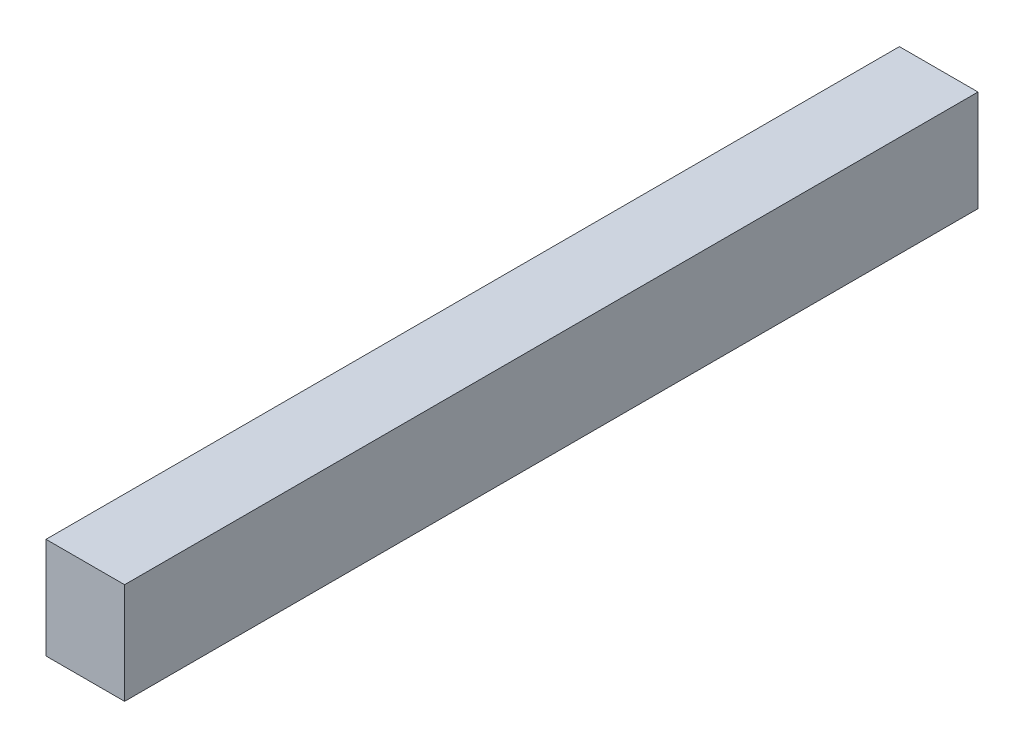
ISO-10303-21;
HEADER;
FILE_DESCRIPTION(('STEP AP214'),'2;1');
FILE_NAME('part.step','',(''),(''),'','','');
FILE_SCHEMA(('AUTOMOTIVE_DESIGN { 1 0 10303 214 1 1 1 1 }'));
ENDSEC;
DATA;
#1=APPLICATION_CONTEXT('core data for automotive mechanical design processes');
#2=APPLICATION_PROTOCOL_DEFINITION('international standard','automotive_design',2000,#1);
#3=PRODUCT_CONTEXT('',#1,'mechanical');
#4=PRODUCT('Part','Part','',(#3));
#5=PRODUCT_RELATED_PRODUCT_CATEGORY('part','',(#4));
#6=PRODUCT_DEFINITION_FORMATION('','',#4);
#7=PRODUCT_DEFINITION_CONTEXT('part definition',#1,'design');
#8=PRODUCT_DEFINITION('design','',#6,#7);
#9=PRODUCT_DEFINITION_SHAPE('','',#8);
#10=(LENGTH_UNIT() NAMED_UNIT(*) SI_UNIT(.MILLI.,.METRE.));
#11=(NAMED_UNIT(*) PLANE_ANGLE_UNIT() SI_UNIT($,.RADIAN.));
#12=(NAMED_UNIT(*) SI_UNIT($,.STERADIAN.) SOLID_ANGLE_UNIT());
#13=UNCERTAINTY_MEASURE_WITH_UNIT(LENGTH_MEASURE(1.E-05),#10,'distance_accuracy_value','');
#14=(GEOMETRIC_REPRESENTATION_CONTEXT(3) GLOBAL_UNCERTAINTY_ASSIGNED_CONTEXT((#13)) GLOBAL_UNIT_ASSIGNED_CONTEXT((#10,
#11,#12)) REPRESENTATION_CONTEXT('',''));
#15=CARTESIAN_POINT('',(0.,0.,0.));
#16=DIRECTION('',(0.,0.,1.));
#17=DIRECTION('',(1.,0.,0.));
#18=AXIS2_PLACEMENT_3D('',#15,#16,#17);
#19=CARTESIAN_POINT('',(-0.660264095803555,0.120228107067753,0.));
#20=DIRECTION('',(-1.,0.,0.));
#21=DIRECTION('',(0.,0.,1.));
#22=AXIS2_PLACEMENT_3D('',#19,#20,#21);
#23=PLANE('',#22);
#24=DIRECTION('',(0.,1.,0.));
#25=VECTOR('',#24,1.);
#26=CARTESIAN_POINT('',(-0.660264095803555,0.345228107067753,0.));
#27=LINE('',#26,#25);
#28=CARTESIAN_POINT('',(-0.660264095803555,0.570228107067753,0.));
#29=VERTEX_POINT('',#28);
#30=CARTESIAN_POINT('',(-0.660264095803555,0.120228107067753,0.));
#31=VERTEX_POINT('',#30);
#32=EDGE_CURVE('E54',#29,#31,#27,.F.);
#33=ORIENTED_EDGE('',*,*,#32,.T.);
#34=DIRECTION('',(0.,0.,-1.));
#35=VECTOR('',#34,1.);
#36=CARTESIAN_POINT('',(-0.660264095803555,0.120228107067753,0.));
#37=LINE('',#36,#35);
#38=CARTESIAN_POINT('',(-0.660264095803555,0.120228107067753,3.8));
#39=VERTEX_POINT('',#38);
#40=EDGE_CURVE('E66',#39,#31,#37,.T.);
#41=ORIENTED_EDGE('',*,*,#40,.F.);
#42=DIRECTION('',(0.,1.,0.));
#43=VECTOR('',#42,1.);
#44=CARTESIAN_POINT('',(-0.660264095803555,0.345228107067753,3.8));
#45=LINE('',#44,#43);
#46=CARTESIAN_POINT('',(-0.660264095803555,0.570228107067753,3.8));
#47=VERTEX_POINT('',#46);
#48=EDGE_CURVE('E19',#47,#39,#45,.F.);
#49=ORIENTED_EDGE('',*,*,#48,.F.);
#50=DIRECTION('',(0.,0.,1.));
#51=VECTOR('',#50,1.);
#52=CARTESIAN_POINT('',(-0.660264095803555,0.570228107067753,0.));
#53=LINE('',#52,#51);
#54=EDGE_CURVE('E80',#29,#47,#53,.T.);
#55=ORIENTED_EDGE('',*,*,#54,.F.);
#56=EDGE_LOOP('',(#33,#41,#49,#55));
#57=FACE_BOUND('',#56,.T.);
#58=ADVANCED_FACE('F16',(#57),#23,.T.);
#59=CARTESIAN_POINT('',(-0.485264095803555,0.345228107067753,3.8));
#60=DIRECTION('',(0.,0.,1.));
#61=DIRECTION('',(1.,0.,0.));
#62=AXIS2_PLACEMENT_3D('',#59,#60,#61);
#63=PLANE('',#62);
#64=ORIENTED_EDGE('',*,*,#48,.T.);
#65=DIRECTION('',(1.,0.,0.));
#66=VECTOR('',#65,1.);
#67=CARTESIAN_POINT('',(-0.310264095803555,0.120228107067753,3.8));
#68=LINE('',#67,#66);
#69=CARTESIAN_POINT('',(-0.310264095803555,0.120228107067753,3.8));
#70=VERTEX_POINT('',#69);
#71=EDGE_CURVE('E61',#70,#39,#68,.F.);
#72=ORIENTED_EDGE('',*,*,#71,.F.);
#73=DIRECTION('',(0.,1.,0.));
#74=VECTOR('',#73,1.);
#75=CARTESIAN_POINT('',(-0.310264095803555,0.570228107067753,3.8));
#76=LINE('',#75,#74);
#77=CARTESIAN_POINT('',(-0.310264095803555,0.570228107067753,3.8));
#78=VERTEX_POINT('',#77);
#79=EDGE_CURVE('E82',#78,#70,#76,.F.);
#80=ORIENTED_EDGE('',*,*,#79,.F.);
#81=DIRECTION('',(1.,0.,0.));
#82=VECTOR('',#81,1.);
#83=CARTESIAN_POINT('',(-0.660264095803555,0.570228107067753,3.8));
#84=LINE('',#83,#82);
#85=EDGE_CURVE('E64',#47,#78,#84,.T.);
#86=ORIENTED_EDGE('',*,*,#85,.F.);
#87=EDGE_LOOP('',(#64,#72,#80,#86));
#88=FACE_BOUND('',#87,.T.);
#89=ADVANCED_FACE('F59',(#88),#63,.T.);
#90=CARTESIAN_POINT('',(-0.310264095803555,0.120228107067753,0.));
#91=DIRECTION('',(0.,-1.,0.));
#92=DIRECTION('',(0.,0.,-1.));
#93=AXIS2_PLACEMENT_3D('',#90,#91,#92);
#94=PLANE('',#93);
#95=DIRECTION('',(1.,0.,0.));
#96=VECTOR('',#95,1.);
#97=CARTESIAN_POINT('',(-0.485264095803555,0.120228107067753,0.));
#98=LINE('',#97,#96);
#99=CARTESIAN_POINT('',(-0.310264095803555,0.120228107067753,0.));
#100=VERTEX_POINT('',#99);
#101=EDGE_CURVE('E76',#31,#100,#98,.T.);
#102=ORIENTED_EDGE('',*,*,#101,.T.);
#103=DIRECTION('',(0.,0.,-1.));
#104=VECTOR('',#103,1.);
#105=CARTESIAN_POINT('',(-0.310264095803555,0.120228107067753,0.));
#106=LINE('',#105,#104);
#107=EDGE_CURVE('E72',#70,#100,#106,.T.);
#108=ORIENTED_EDGE('',*,*,#107,.F.);
#109=ORIENTED_EDGE('',*,*,#71,.T.);
#110=ORIENTED_EDGE('',*,*,#40,.T.);
#111=EDGE_LOOP('',(#102,#108,#109,#110));
#112=FACE_BOUND('',#111,.T.);
#113=ADVANCED_FACE('F70',(#112),#94,.T.);
#114=CARTESIAN_POINT('',(-0.485264095803555,0.345228107067753,0.));
#115=DIRECTION('',(0.,0.,1.));
#116=DIRECTION('',(1.,0.,0.));
#117=AXIS2_PLACEMENT_3D('',#114,#115,#116);
#118=PLANE('',#117);
#119=DIRECTION('',(0.,1.,0.));
#120=VECTOR('',#119,1.);
#121=CARTESIAN_POINT('',(-0.310264095803555,0.570228107067753,0.));
#122=LINE('',#121,#120);
#123=CARTESIAN_POINT('',(-0.310264095803555,0.570228107067753,0.));
#124=VERTEX_POINT('',#123);
#125=EDGE_CURVE('E25',#100,#124,#122,.T.);
#126=ORIENTED_EDGE('',*,*,#125,.F.);
#127=ORIENTED_EDGE('',*,*,#101,.F.);
#128=ORIENTED_EDGE('',*,*,#32,.F.);
#129=DIRECTION('',(1.,0.,0.));
#130=VECTOR('',#129,1.);
#131=CARTESIAN_POINT('',(-0.660264095803555,0.570228107067753,0.));
#132=LINE('',#131,#130);
#133=EDGE_CURVE('E34',#124,#29,#132,.F.);
#134=ORIENTED_EDGE('',*,*,#133,.F.);
#135=EDGE_LOOP('',(#126,#127,#128,#134));
#136=FACE_BOUND('',#135,.T.);
#137=ADVANCED_FACE('F88',(#136),#118,.F.);
#138=CARTESIAN_POINT('',(-0.660264095803555,0.570228107067753,0.));
#139=DIRECTION('',(0.,1.,0.));
#140=DIRECTION('',(0.,0.,1.));
#141=AXIS2_PLACEMENT_3D('',#138,#139,#140);
#142=PLANE('',#141);
#143=ORIENTED_EDGE('',*,*,#133,.T.);
#144=ORIENTED_EDGE('',*,*,#54,.T.);
#145=ORIENTED_EDGE('',*,*,#85,.T.);
#146=DIRECTION('',(0.,0.,-1.));
#147=VECTOR('',#146,1.);
#148=CARTESIAN_POINT('',(-0.310264095803555,0.570228107067753,0.));
#149=LINE('',#148,#147);
#150=EDGE_CURVE('E10',#124,#78,#149,.F.);
#151=ORIENTED_EDGE('',*,*,#150,.F.);
#152=EDGE_LOOP('',(#143,#144,#145,#151));
#153=FACE_BOUND('',#152,.T.);
#154=ADVANCED_FACE('F90',(#153),#142,.T.);
#155=CARTESIAN_POINT('',(-0.310264095803555,0.570228107067753,0.));
#156=DIRECTION('',(1.,0.,0.));
#157=DIRECTION('',(0.,0.,-1.));
#158=AXIS2_PLACEMENT_3D('',#155,#156,#157);
#159=PLANE('',#158);
#160=ORIENTED_EDGE('',*,*,#125,.T.);
#161=ORIENTED_EDGE('',*,*,#150,.T.);
#162=ORIENTED_EDGE('',*,*,#79,.T.);
#163=ORIENTED_EDGE('',*,*,#107,.T.);
#164=EDGE_LOOP('',(#160,#161,#162,#163));
#165=FACE_BOUND('',#164,.T.);
#166=ADVANCED_FACE('F87',(#165),#159,.T.);
#167=CLOSED_SHELL('',(#58,#89,#113,#137,#154,#166));
#168=MANIFOLD_SOLID_BREP('B1',#167);
#169=ADVANCED_BREP_SHAPE_REPRESENTATION('',(#18,#168),#14);
#170=SHAPE_DEFINITION_REPRESENTATION(#9,#169);
ENDSEC;
END-ISO-10303-21;
